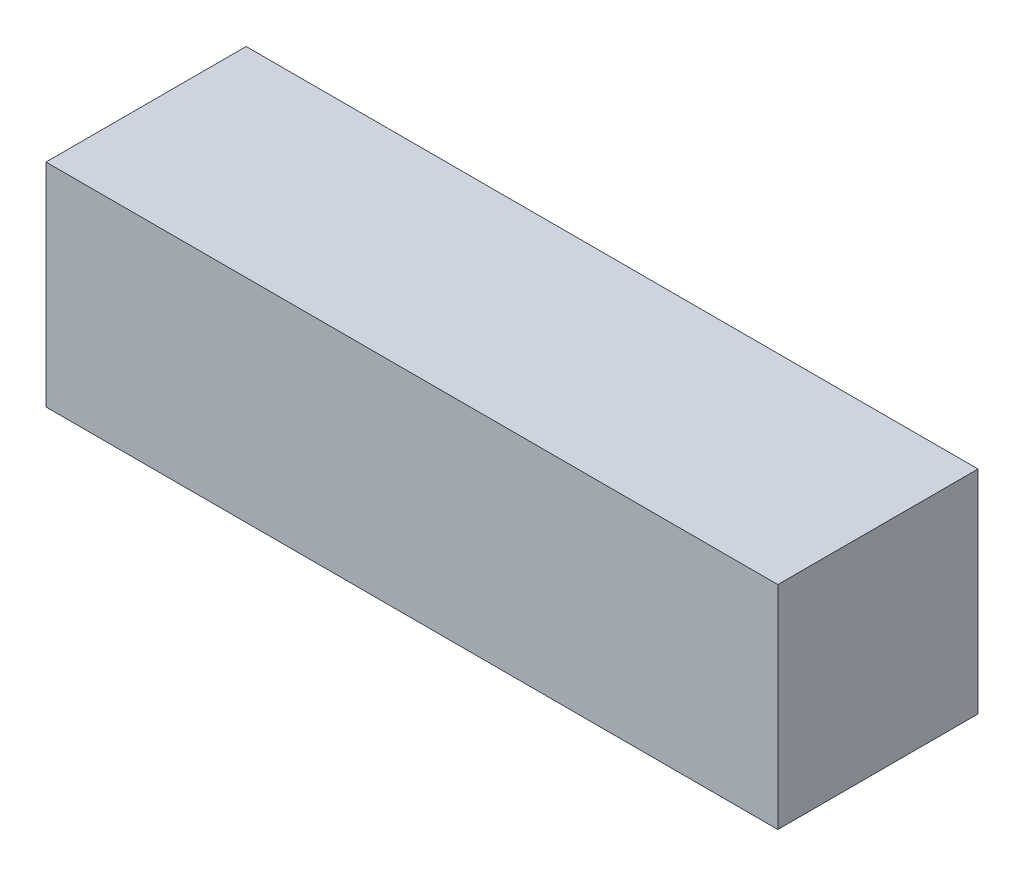
ISO-10303-21;
HEADER;
FILE_DESCRIPTION(('STEP AP214'),'2;1');
FILE_NAME('part.step','',(''),(''),'','','');
FILE_SCHEMA(('AUTOMOTIVE_DESIGN { 1 0 10303 214 1 1 1 1 }'));
ENDSEC;
DATA;
#1=APPLICATION_CONTEXT('core data for automotive mechanical design processes');
#2=APPLICATION_PROTOCOL_DEFINITION('international standard','automotive_design',2000,#1);
#3=PRODUCT_CONTEXT('',#1,'mechanical');
#4=PRODUCT('Part','Part','',(#3));
#5=PRODUCT_RELATED_PRODUCT_CATEGORY('part','',(#4));
#6=PRODUCT_DEFINITION_FORMATION('','',#4);
#7=PRODUCT_DEFINITION_CONTEXT('part definition',#1,'design');
#8=PRODUCT_DEFINITION('design','',#6,#7);
#9=PRODUCT_DEFINITION_SHAPE('','',#8);
#10=(LENGTH_UNIT() NAMED_UNIT(*) SI_UNIT(.MILLI.,.METRE.));
#11=(NAMED_UNIT(*) PLANE_ANGLE_UNIT() SI_UNIT($,.RADIAN.));
#12=(NAMED_UNIT(*) SI_UNIT($,.STERADIAN.) SOLID_ANGLE_UNIT());
#13=UNCERTAINTY_MEASURE_WITH_UNIT(LENGTH_MEASURE(1.E-05),#10,'distance_accuracy_value','');
#14=(GEOMETRIC_REPRESENTATION_CONTEXT(3) GLOBAL_UNCERTAINTY_ASSIGNED_CONTEXT((#13)) GLOBAL_UNIT_ASSIGNED_CONTEXT((#10,
#11,#12)) REPRESENTATION_CONTEXT('',''));
#15=CARTESIAN_POINT('',(0.,0.,0.));
#16=DIRECTION('',(0.,0.,1.));
#17=DIRECTION('',(1.,0.,0.));
#18=AXIS2_PLACEMENT_3D('',#15,#16,#17);
#19=CARTESIAN_POINT('',(44.5,-1.9,-11.35));
#20=DIRECTION('',(0.,0.,-1.));
#21=DIRECTION('',(-1.,0.,0.));
#22=AXIS2_PLACEMENT_3D('',#19,#20,#21);
#23=PLANE('',#22);
#24=DIRECTION('',(1.,0.,0.));
#25=VECTOR('',#24,1.);
#26=CARTESIAN_POINT('',(-74.5774688046491,-20.0588641153879,-11.35));
#27=LINE('',#26,#25);
#28=CARTESIAN_POINT('',(-41.4999999999976,-20.0588641153879,-11.35));
#29=VERTEX_POINT('',#28);
#30=CARTESIAN_POINT('',(41.4999999999981,-20.0588641153879,-11.35));
#31=VERTEX_POINT('',#30);
#32=EDGE_CURVE('E119',#29,#31,#27,.T.);
#33=ORIENTED_EDGE('',*,*,#32,.F.);
#34=DIRECTION('',(0.,1.,0.));
#35=VECTOR('',#34,1.);
#36=CARTESIAN_POINT('',(-41.4999999999976,-50.1529352364648,-11.35));
#37=LINE('',#36,#35);
#38=CARTESIAN_POINT('',(-41.4999999999976,4.,-11.35));
#39=VERTEX_POINT('',#38);
#40=EDGE_CURVE('E87',#29,#39,#37,.T.);
#41=ORIENTED_EDGE('',*,*,#40,.T.);
#42=DIRECTION('',(-1.,0.,0.));
#43=VECTOR('',#42,1.);
#44=CARTESIAN_POINT('',(44.5,4.,-11.35));
#45=LINE('',#44,#43);
#46=CARTESIAN_POINT('',(41.4999999999981,4.,-11.35));
#47=VERTEX_POINT('',#46);
#48=EDGE_CURVE('E12',#47,#39,#45,.T.);
#49=ORIENTED_EDGE('',*,*,#48,.F.);
#50=DIRECTION('',(0.,1.,0.));
#51=VECTOR('',#50,1.);
#52=CARTESIAN_POINT('',(41.4999999999981,-50.1529352364663,-11.35));
#53=LINE('',#52,#51);
#54=EDGE_CURVE('E85',#31,#47,#53,.T.);
#55=ORIENTED_EDGE('',*,*,#54,.F.);
#56=EDGE_LOOP('',(#33,#41,#49,#55));
#57=FACE_BOUND('',#56,.T.);
#58=ADVANCED_FACE('F45',(#57),#23,.T.);
#59=CARTESIAN_POINT('',(0.,4.,0.));
#60=DIRECTION('',(0.,1.,0.));
#61=DIRECTION('',(0.,0.,1.));
#62=AXIS2_PLACEMENT_3D('',#59,#60,#61);
#63=PLANE('',#62);
#64=ORIENTED_EDGE('',*,*,#48,.T.);
#65=DIRECTION('',(0.,0.,1.));
#66=VECTOR('',#65,1.);
#67=CARTESIAN_POINT('',(-41.5000000000001,4.,-15.5926406871193));
#68=LINE('',#67,#66);
#69=CARTESIAN_POINT('',(-41.4999999999976,4.,11.35));
#70=VERTEX_POINT('',#69);
#71=EDGE_CURVE('E96',#39,#70,#68,.T.);
#72=ORIENTED_EDGE('',*,*,#71,.T.);
#73=DIRECTION('',(1.,0.,0.));
#74=VECTOR('',#73,1.);
#75=CARTESIAN_POINT('',(44.5,4.,11.35));
#76=LINE('',#75,#74);
#77=CARTESIAN_POINT('',(41.4999999999981,4.,11.35));
#78=VERTEX_POINT('',#77);
#79=EDGE_CURVE('E55',#70,#78,#76,.T.);
#80=ORIENTED_EDGE('',*,*,#79,.T.);
#81=DIRECTION('',(0.,0.,1.));
#82=VECTOR('',#81,1.);
#83=CARTESIAN_POINT('',(41.4999999999999,4.,-15.5926406871193));
#84=LINE('',#83,#82);
#85=EDGE_CURVE('E92',#47,#78,#84,.T.);
#86=ORIENTED_EDGE('',*,*,#85,.F.);
#87=EDGE_LOOP('',(#64,#72,#80,#86));
#88=FACE_BOUND('',#87,.T.);
#89=ADVANCED_FACE('F93',(#88),#63,.T.);
#90=CARTESIAN_POINT('',(-41.4999999999976,-50.1529352364648,-11.35));
#91=DIRECTION('',(1.,0.,0.));
#92=DIRECTION('',(0.,0.,-1.));
#93=AXIS2_PLACEMENT_3D('',#90,#91,#92);
#94=PLANE('',#93);
#95=ORIENTED_EDGE('',*,*,#71,.F.);
#96=ORIENTED_EDGE('',*,*,#40,.F.);
#97=DIRECTION('',(0.,0.,1.));
#98=VECTOR('',#97,1.);
#99=CARTESIAN_POINT('',(-41.4999999999976,-20.0588641153879,-11.35));
#100=LINE('',#99,#98);
#101=CARTESIAN_POINT('',(-41.4999999999976,-20.0588641153879,11.35));
#102=VERTEX_POINT('',#101);
#103=EDGE_CURVE('E115',#29,#102,#100,.T.);
#104=ORIENTED_EDGE('',*,*,#103,.T.);
#105=DIRECTION('',(0.,1.,0.));
#106=VECTOR('',#105,1.);
#107=CARTESIAN_POINT('',(-41.4999999999976,-50.1529352364648,11.35));
#108=LINE('',#107,#106);
#109=EDGE_CURVE('E61',#102,#70,#108,.T.);
#110=ORIENTED_EDGE('',*,*,#109,.T.);
#111=EDGE_LOOP('',(#95,#96,#104,#110));
#112=FACE_BOUND('',#111,.T.);
#113=ADVANCED_FACE('F113',(#112),#94,.F.);
#114=CARTESIAN_POINT('',(41.4999999999981,-50.1529352364663,11.35));
#115=DIRECTION('',(-1.,0.,0.));
#116=DIRECTION('',(0.,0.,1.));
#117=AXIS2_PLACEMENT_3D('',#114,#115,#116);
#118=PLANE('',#117);
#119=DIRECTION('',(0.,0.,-1.));
#120=VECTOR('',#119,1.);
#121=CARTESIAN_POINT('',(41.4999999999981,-20.0588641153879,-11.35));
#122=LINE('',#121,#120);
#123=CARTESIAN_POINT('',(41.4999999999981,-20.0588641153879,11.35));
#124=VERTEX_POINT('',#123);
#125=EDGE_CURVE('E102',#124,#31,#122,.T.);
#126=ORIENTED_EDGE('',*,*,#125,.T.);
#127=ORIENTED_EDGE('',*,*,#54,.T.);
#128=ORIENTED_EDGE('',*,*,#85,.T.);
#129=DIRECTION('',(0.,1.,0.));
#130=VECTOR('',#129,1.);
#131=CARTESIAN_POINT('',(41.4999999999981,-50.1529352364663,11.35));
#132=LINE('',#131,#130);
#133=EDGE_CURVE('E97',#124,#78,#132,.T.);
#134=ORIENTED_EDGE('',*,*,#133,.F.);
#135=EDGE_LOOP('',(#126,#127,#128,#134));
#136=FACE_BOUND('',#135,.T.);
#137=ADVANCED_FACE('F100',(#136),#118,.F.);
#138=CARTESIAN_POINT('',(44.5,-1.9,11.35));
#139=DIRECTION('',(0.,0.,1.));
#140=DIRECTION('',(1.,0.,0.));
#141=AXIS2_PLACEMENT_3D('',#138,#139,#140);
#142=PLANE('',#141);
#143=DIRECTION('',(1.,0.,0.));
#144=VECTOR('',#143,1.);
#145=CARTESIAN_POINT('',(41.4999999999976,-20.0588641153879,11.35));
#146=LINE('',#145,#144);
#147=EDGE_CURVE('E116',#102,#124,#146,.T.);
#148=ORIENTED_EDGE('',*,*,#147,.T.);
#149=ORIENTED_EDGE('',*,*,#133,.T.);
#150=ORIENTED_EDGE('',*,*,#79,.F.);
#151=ORIENTED_EDGE('',*,*,#109,.F.);
#152=EDGE_LOOP('',(#148,#149,#150,#151));
#153=FACE_BOUND('',#152,.T.);
#154=ADVANCED_FACE('F47',(#153),#142,.T.);
#155=CARTESIAN_POINT('',(0.,-20.0588641153879,0.));
#156=DIRECTION('',(0.,-1.,0.));
#157=DIRECTION('',(0.,0.,-1.));
#158=AXIS2_PLACEMENT_3D('',#155,#156,#157);
#159=PLANE('',#158);
#160=ORIENTED_EDGE('',*,*,#125,.F.);
#161=ORIENTED_EDGE('',*,*,#147,.F.);
#162=ORIENTED_EDGE('',*,*,#103,.F.);
#163=ORIENTED_EDGE('',*,*,#32,.T.);
#164=EDGE_LOOP('',(#160,#161,#162,#163));
#165=FACE_BOUND('',#164,.T.);
#166=ADVANCED_FACE('F123',(#165),#159,.T.);
#167=CLOSED_SHELL('',(#58,#89,#113,#137,#154,#166));
#168=MANIFOLD_SOLID_BREP('B2',#167);
#169=ADVANCED_BREP_SHAPE_REPRESENTATION('',(#18,#168),#14);
#170=SHAPE_DEFINITION_REPRESENTATION(#9,#169);
ENDSEC;
END-ISO-10303-21;
